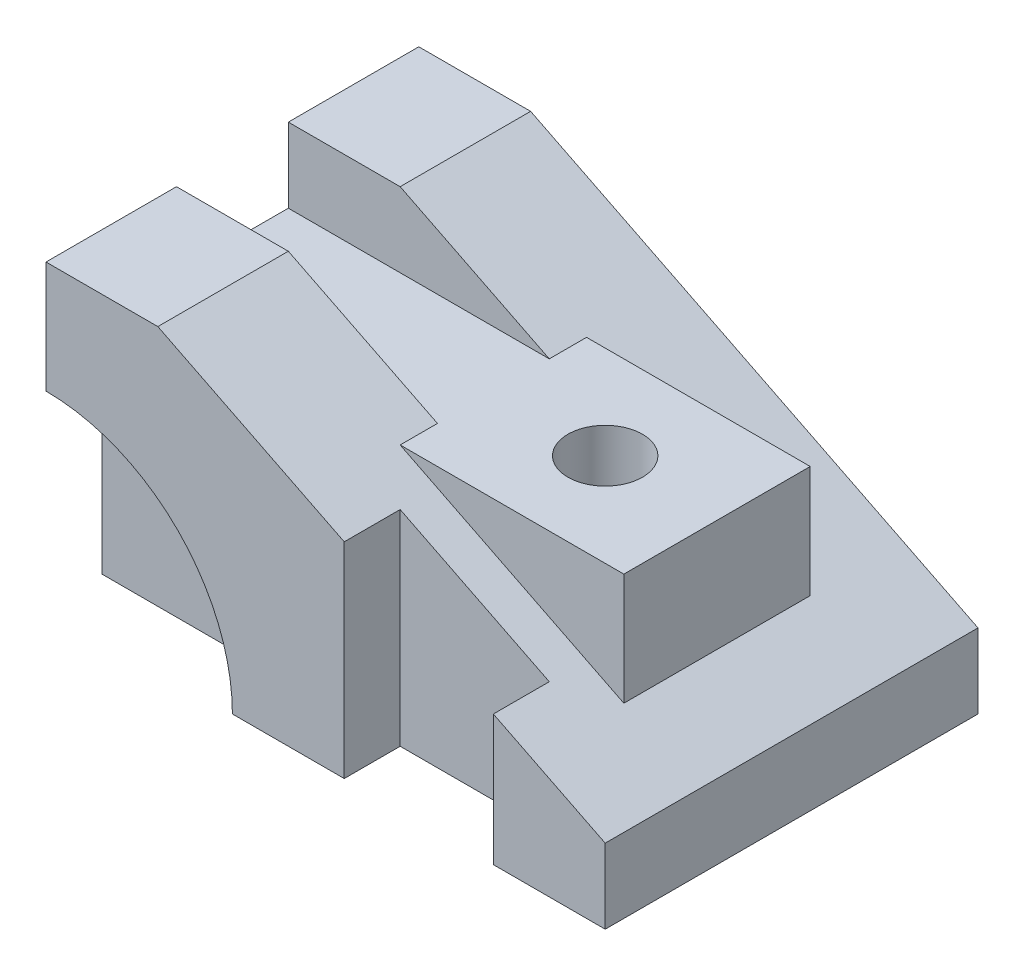
ISO-10303-21;
HEADER;
FILE_DESCRIPTION(('STEP AP214'),'2;1');
FILE_NAME('part.step','',(''),(''),'','','');
FILE_SCHEMA(('AUTOMOTIVE_DESIGN { 1 0 10303 214 1 1 1 1 }'));
ENDSEC;
DATA;
#1=APPLICATION_CONTEXT('core data for automotive mechanical design processes');
#2=APPLICATION_PROTOCOL_DEFINITION('international standard','automotive_design',2000,#1);
#3=PRODUCT_CONTEXT('',#1,'mechanical');
#4=PRODUCT('Part','Part','',(#3));
#5=PRODUCT_RELATED_PRODUCT_CATEGORY('part','',(#4));
#6=PRODUCT_DEFINITION_FORMATION('','',#4);
#7=PRODUCT_DEFINITION_CONTEXT('part definition',#1,'design');
#8=PRODUCT_DEFINITION('design','',#6,#7);
#9=PRODUCT_DEFINITION_SHAPE('','',#8);
#10=(LENGTH_UNIT() NAMED_UNIT(*) SI_UNIT(.MILLI.,.METRE.));
#11=(NAMED_UNIT(*) PLANE_ANGLE_UNIT() SI_UNIT($,.RADIAN.));
#12=(NAMED_UNIT(*) SI_UNIT($,.STERADIAN.) SOLID_ANGLE_UNIT());
#13=UNCERTAINTY_MEASURE_WITH_UNIT(LENGTH_MEASURE(1.E-05),#10,'distance_accuracy_value','');
#14=(GEOMETRIC_REPRESENTATION_CONTEXT(3) GLOBAL_UNCERTAINTY_ASSIGNED_CONTEXT((#13)) GLOBAL_UNIT_ASSIGNED_CONTEXT((#10,
#11,#12)) REPRESENTATION_CONTEXT('',''));
#15=CARTESIAN_POINT('',(0.,0.,0.));
#16=DIRECTION('',(0.,0.,1.));
#17=DIRECTION('',(1.,0.,0.));
#18=AXIS2_PLACEMENT_3D('',#15,#16,#17);
#19=CARTESIAN_POINT('',(0.,0.,50.));
#20=DIRECTION('',(-1.,0.,0.));
#21=DIRECTION('',(0.,0.,1.));
#22=AXIS2_PLACEMENT_3D('',#19,#20,#21);
#23=PLANE('',#22);
#24=DIRECTION('',(0.,1.,0.));
#25=VECTOR('',#24,1.);
#26=CARTESIAN_POINT('',(0.,0.,35.));
#27=LINE('',#26,#25);
#28=CARTESIAN_POINT('',(0.,0.,35.));
#29=VERTEX_POINT('',#28);
#30=CARTESIAN_POINT('',(0.,50.,35.));
#31=VERTEX_POINT('',#30);
#32=EDGE_CURVE('E56',#29,#31,#27,.T.);
#33=ORIENTED_EDGE('',*,*,#32,.T.);
#34=DIRECTION('',(0.,0.,-1.));
#35=VECTOR('',#34,1.);
#36=CARTESIAN_POINT('',(0.,50.,50.000012));
#37=LINE('',#36,#35);
#38=CARTESIAN_POINT('',(0.,50.,50.));
#39=VERTEX_POINT('',#38);
#40=EDGE_CURVE('E174',#31,#39,#37,.F.);
#41=ORIENTED_EDGE('',*,*,#40,.T.);
#42=DIRECTION('',(0.,1.,0.));
#43=VECTOR('',#42,1.);
#44=CARTESIAN_POINT('',(0.,0.,50.));
#45=LINE('',#44,#43);
#46=CARTESIAN_POINT('',(0.,80.,50.));
#47=VERTEX_POINT('',#46);
#48=EDGE_CURVE('E187',#39,#47,#45,.T.);
#49=ORIENTED_EDGE('',*,*,#48,.T.);
#50=DIRECTION('',(0.,0.,-1.));
#51=VECTOR('',#50,1.);
#52=CARTESIAN_POINT('',(0.,80.,50.));
#53=LINE('',#52,#51);
#54=CARTESIAN_POINT('',(0.,80.,15.));
#55=VERTEX_POINT('',#54);
#56=EDGE_CURVE('E221',#47,#55,#53,.T.);
#57=ORIENTED_EDGE('',*,*,#56,.T.);
#58=DIRECTION('',(0.,1.,0.));
#59=VECTOR('',#58,1.);
#60=CARTESIAN_POINT('',(0.,-16.157731058639,15.));
#61=LINE('',#60,#59);
#62=CARTESIAN_POINT('',(0.,60.,15.));
#63=VERTEX_POINT('',#62);
#64=EDGE_CURVE('E272',#63,#55,#61,.T.);
#65=ORIENTED_EDGE('',*,*,#64,.F.);
#66=DIRECTION('',(0.,0.,1.));
#67=VECTOR('',#66,1.);
#68=CARTESIAN_POINT('',(0.,60.,50.));
#69=LINE('',#68,#67);
#70=CARTESIAN_POINT('',(0.,60.,-15.));
#71=VERTEX_POINT('',#70);
#72=EDGE_CURVE('E263',#71,#63,#69,.T.);
#73=ORIENTED_EDGE('',*,*,#72,.F.);
#74=DIRECTION('',(0.,1.,0.));
#75=VECTOR('',#74,1.);
#76=CARTESIAN_POINT('',(0.,-16.157731058639,-15.));
#77=LINE('',#76,#75);
#78=CARTESIAN_POINT('',(0.,80.,-15.));
#79=VERTEX_POINT('',#78);
#80=EDGE_CURVE('E264',#71,#79,#77,.T.);
#81=ORIENTED_EDGE('',*,*,#80,.T.);
#82=CARTESIAN_POINT('',(0.,80.,-50.));
#83=VERTEX_POINT('',#82);
#84=EDGE_CURVE('E220',#79,#83,#53,.T.);
#85=ORIENTED_EDGE('',*,*,#84,.T.);
#86=DIRECTION('',(0.,1.,0.));
#87=VECTOR('',#86,1.);
#88=CARTESIAN_POINT('',(0.,0.,-50.));
#89=LINE('',#88,#87);
#90=CARTESIAN_POINT('',(0.,0.,-50.));
#91=VERTEX_POINT('',#90);
#92=EDGE_CURVE('E205',#91,#83,#89,.T.);
#93=ORIENTED_EDGE('',*,*,#92,.F.);
#94=DIRECTION('',(0.,0.,-1.));
#95=VECTOR('',#94,1.);
#96=CARTESIAN_POINT('',(0.,0.,50.));
#97=LINE('',#96,#95);
#98=EDGE_CURVE('E218',#29,#91,#97,.T.);
#99=ORIENTED_EDGE('',*,*,#98,.F.);
#100=EDGE_LOOP('',(#33,#41,#49,#57,#65,#73,#81,#85,#93,#99));
#101=FACE_BOUND('',#100,.T.);
#102=ADVANCED_FACE('F41',(#101),#23,.T.);
#103=CARTESIAN_POINT('',(0.,0.,50.));
#104=DIRECTION('',(0.,-1.,0.));
#105=DIRECTION('',(1.,0.,0.));
#106=AXIS2_PLACEMENT_3D('',#103,#104,#105);
#107=PLANE('',#106);
#108=CARTESIAN_POINT('',(100.,0.,0.));
#109=DIRECTION('',(0.,-1.,0.));
#110=DIRECTION('',(1.,0.,0.));
#111=AXIS2_PLACEMENT_3D('',#108,#109,#110);
#112=CIRCLE('',#111,9.99999999999999);
#113=CARTESIAN_POINT('',(100.,0.,9.99999999999999));
#114=VERTEX_POINT('',#113);
#115=EDGE_CURVE('E233',#114,#114,#112,.T.);
#116=ORIENTED_EDGE('',*,*,#115,.F.);
#117=EDGE_LOOP('',(#116));
#118=FACE_BOUND('',#117,.T.);
#119=DIRECTION('',(-1.,0.,0.));
#120=VECTOR('',#119,1.);
#121=CARTESIAN_POINT('',(0.,0.,50.));
#122=LINE('',#121,#120);
#123=CARTESIAN_POINT('',(80.,0.,50.));
#124=VERTEX_POINT('',#123);
#125=CARTESIAN_POINT('',(50.,0.,50.));
#126=VERTEX_POINT('',#125);
#127=EDGE_CURVE('E180',#124,#126,#122,.T.);
#128=ORIENTED_EDGE('',*,*,#127,.T.);
#129=DIRECTION('',(0.,0.,-1.));
#130=VECTOR('',#129,1.);
#131=CARTESIAN_POINT('',(50.,0.,50.000012));
#132=LINE('',#131,#130);
#133=CARTESIAN_POINT('',(50.,0.,35.));
#134=VERTEX_POINT('',#133);
#135=EDGE_CURVE('E11',#126,#134,#132,.T.);
#136=ORIENTED_EDGE('',*,*,#135,.T.);
#137=DIRECTION('',(-1.,0.,0.));
#138=VECTOR('',#137,1.);
#139=CARTESIAN_POINT('',(0.,0.,35.));
#140=LINE('',#139,#138);
#141=EDGE_CURVE('E49',#134,#29,#140,.T.);
#142=ORIENTED_EDGE('',*,*,#141,.T.);
#143=ORIENTED_EDGE('',*,*,#98,.T.);
#144=DIRECTION('',(-1.,0.,0.));
#145=VECTOR('',#144,1.);
#146=CARTESIAN_POINT('',(0.,0.,-50.));
#147=LINE('',#146,#145);
#148=CARTESIAN_POINT('',(150.,0.,-50.));
#149=VERTEX_POINT('',#148);
#150=EDGE_CURVE('E208',#149,#91,#147,.T.);
#151=ORIENTED_EDGE('',*,*,#150,.F.);
#152=DIRECTION('',(0.,0.,-1.));
#153=VECTOR('',#152,1.);
#154=CARTESIAN_POINT('',(150.,0.,50.));
#155=LINE('',#154,#153);
#156=CARTESIAN_POINT('',(150.,0.,50.));
#157=VERTEX_POINT('',#156);
#158=EDGE_CURVE('E216',#157,#149,#155,.T.);
#159=ORIENTED_EDGE('',*,*,#158,.F.);
#160=CARTESIAN_POINT('',(120.,0.,50.));
#161=VERTEX_POINT('',#160);
#162=EDGE_CURVE('E186',#157,#161,#122,.T.);
#163=ORIENTED_EDGE('',*,*,#162,.T.);
#164=DIRECTION('',(0.,0.,1.));
#165=VECTOR('',#164,1.);
#166=CARTESIAN_POINT('',(120.,0.,35.));
#167=LINE('',#166,#165);
#168=CARTESIAN_POINT('',(120.,0.,35.));
#169=VERTEX_POINT('',#168);
#170=EDGE_CURVE('E64',#169,#161,#167,.T.);
#171=ORIENTED_EDGE('',*,*,#170,.F.);
#172=DIRECTION('',(1.,0.,0.));
#173=VECTOR('',#172,1.);
#174=CARTESIAN_POINT('',(80.,0.,35.));
#175=LINE('',#174,#173);
#176=CARTESIAN_POINT('',(80.,0.,35.));
#177=VERTEX_POINT('',#176);
#178=EDGE_CURVE('E246',#177,#169,#175,.T.);
#179=ORIENTED_EDGE('',*,*,#178,.F.);
#180=DIRECTION('',(0.,0.,-1.));
#181=VECTOR('',#180,1.);
#182=CARTESIAN_POINT('',(80.,0.,50.));
#183=LINE('',#182,#181);
#184=EDGE_CURVE('E183',#124,#177,#183,.T.);
#185=ORIENTED_EDGE('',*,*,#184,.F.);
#186=EDGE_LOOP('',(#128,#136,#142,#143,#151,#159,#163,#171,#179,#185));
#187=FACE_BOUND('',#186,.T.);
#188=ADVANCED_FACE('F177',(#118,#187),#107,.T.);
#189=CARTESIAN_POINT('',(0.,0.,50.));
#190=DIRECTION('',(0.,0.,1.));
#191=DIRECTION('',(1.,0.,0.));
#192=AXIS2_PLACEMENT_3D('',#189,#190,#191);
#193=PLANE('',#192);
#194=ORIENTED_EDGE('',*,*,#48,.F.);
#195=CARTESIAN_POINT('',(0.,0.,50.));
#196=DIRECTION('',(0.,0.,1.));
#197=DIRECTION('',(1.,0.,0.));
#198=AXIS2_PLACEMENT_3D('',#195,#196,#197);
#199=CIRCLE('',#198,50.);
#200=EDGE_CURVE('E238',#39,#126,#199,.F.);
#201=ORIENTED_EDGE('',*,*,#200,.T.);
#202=ORIENTED_EDGE('',*,*,#127,.F.);
#203=DIRECTION('',(0.,-1.,0.));
#204=VECTOR('',#203,1.);
#205=CARTESIAN_POINT('',(80.,0.,50.));
#206=LINE('',#205,#204);
#207=CARTESIAN_POINT('',(80.,55.,50.));
#208=VERTEX_POINT('',#207);
#209=EDGE_CURVE('E169',#208,#124,#206,.T.);
#210=ORIENTED_EDGE('',*,*,#209,.F.);
#211=DIRECTION('',(0.894427190999916,-0.447213595499958,0.));
#212=VECTOR('',#211,1.);
#213=CARTESIAN_POINT('',(38.,76.,50.));
#214=LINE('',#213,#212);
#215=CARTESIAN_POINT('',(30.,80.,50.));
#216=VERTEX_POINT('',#215);
#217=EDGE_CURVE('E307',#216,#208,#214,.T.);
#218=ORIENTED_EDGE('',*,*,#217,.F.);
#219=DIRECTION('',(1.,0.,0.));
#220=VECTOR('',#219,1.);
#221=CARTESIAN_POINT('',(0.,80.,50.));
#222=LINE('',#221,#220);
#223=EDGE_CURVE('E191',#47,#216,#222,.T.);
#224=ORIENTED_EDGE('',*,*,#223,.F.);
#225=EDGE_LOOP('',(#194,#201,#202,#210,#218,#224));
#226=FACE_BOUND('',#225,.T.);
#227=ADVANCED_FACE('F316',(#226),#193,.T.);
#228=CARTESIAN_POINT('',(38.,76.,50.));
#229=DIRECTION('',(0.447213595499958,0.894427190999916,0.));
#230=DIRECTION('',(-0.894427190999916,0.447213595499958,0.));
#231=AXIS2_PLACEMENT_3D('',#228,#229,#230);
#232=PLANE('',#231);
#233=DIRECTION('',(0.,0.,1.));
#234=VECTOR('',#233,1.);
#235=CARTESIAN_POINT('',(80.,55.,50.));
#236=LINE('',#235,#234);
#237=CARTESIAN_POINT('',(80.,55.,35.));
#238=VERTEX_POINT('',#237);
#239=EDGE_CURVE('E256',#238,#208,#236,.T.);
#240=ORIENTED_EDGE('',*,*,#239,.F.);
#241=DIRECTION('',(-0.894427190999916,0.447213595499958,0.));
#242=VECTOR('',#241,1.);
#243=CARTESIAN_POINT('',(38.,76.,35.));
#244=LINE('',#243,#242);
#245=CARTESIAN_POINT('',(120.,35.,35.));
#246=VERTEX_POINT('',#245);
#247=EDGE_CURVE('E258',#246,#238,#244,.T.);
#248=ORIENTED_EDGE('',*,*,#247,.F.);
#249=DIRECTION('',(0.,0.,-1.));
#250=VECTOR('',#249,1.);
#251=CARTESIAN_POINT('',(120.,35.,50.));
#252=LINE('',#251,#250);
#253=CARTESIAN_POINT('',(120.,35.,50.));
#254=VERTEX_POINT('',#253);
#255=EDGE_CURVE('E253',#254,#246,#252,.T.);
#256=ORIENTED_EDGE('',*,*,#255,.F.);
#257=CARTESIAN_POINT('',(150.,20.,50.));
#258=VERTEX_POINT('',#257);
#259=EDGE_CURVE('E214',#254,#258,#214,.T.);
#260=ORIENTED_EDGE('',*,*,#259,.T.);
#261=DIRECTION('',(0.,0.,-1.));
#262=VECTOR('',#261,1.);
#263=CARTESIAN_POINT('',(150.,20.,50.));
#264=LINE('',#263,#262);
#265=CARTESIAN_POINT('',(150.,20.,-50.));
#266=VERTEX_POINT('',#265);
#267=EDGE_CURVE('E197',#258,#266,#264,.T.);
#268=ORIENTED_EDGE('',*,*,#267,.T.);
#269=DIRECTION('',(0.894427190999916,-0.447213595499958,0.));
#270=VECTOR('',#269,1.);
#271=CARTESIAN_POINT('',(38.,76.,-50.));
#272=LINE('',#271,#270);
#273=CARTESIAN_POINT('',(30.,80.,-50.));
#274=VERTEX_POINT('',#273);
#275=EDGE_CURVE('E198',#274,#266,#272,.T.);
#276=ORIENTED_EDGE('',*,*,#275,.F.);
#277=DIRECTION('',(0.,0.,-1.));
#278=VECTOR('',#277,1.);
#279=CARTESIAN_POINT('',(30.,80.,50.));
#280=LINE('',#279,#278);
#281=CARTESIAN_POINT('',(30.,80.,-15.));
#282=VERTEX_POINT('',#281);
#283=EDGE_CURVE('E224',#282,#274,#280,.T.);
#284=ORIENTED_EDGE('',*,*,#283,.F.);
#285=DIRECTION('',(0.894427190999916,-0.447213595499958,0.));
#286=VECTOR('',#285,1.);
#287=CARTESIAN_POINT('',(38.,76.,-15.));
#288=LINE('',#287,#286);
#289=CARTESIAN_POINT('',(70.,60.,-15.));
#290=VERTEX_POINT('',#289);
#291=EDGE_CURVE('E280',#282,#290,#288,.T.);
#292=ORIENTED_EDGE('',*,*,#291,.T.);
#293=DIRECTION('',(0.,0.,-1.));
#294=VECTOR('',#293,1.);
#295=CARTESIAN_POINT('',(70.,60.,25.));
#296=LINE('',#295,#294);
#297=CARTESIAN_POINT('',(70.,60.,-25.));
#298=VERTEX_POINT('',#297);
#299=EDGE_CURVE('E304',#290,#298,#296,.T.);
#300=ORIENTED_EDGE('',*,*,#299,.T.);
#301=DIRECTION('',(0.894427190999916,-0.447213595499958,0.));
#302=VECTOR('',#301,1.);
#303=CARTESIAN_POINT('',(38.,76.,-25.));
#304=LINE('',#303,#302);
#305=CARTESIAN_POINT('',(130.,30.,-25.));
#306=VERTEX_POINT('',#305);
#307=EDGE_CURVE('E296',#298,#306,#304,.T.);
#308=ORIENTED_EDGE('',*,*,#307,.T.);
#309=DIRECTION('',(0.,0.,-1.));
#310=VECTOR('',#309,1.);
#311=CARTESIAN_POINT('',(130.,30.,25.));
#312=LINE('',#311,#310);
#313=CARTESIAN_POINT('',(130.,30.,25.));
#314=VERTEX_POINT('',#313);
#315=EDGE_CURVE('E302',#314,#306,#312,.T.);
#316=ORIENTED_EDGE('',*,*,#315,.F.);
#317=DIRECTION('',(0.894427190999916,-0.447213595499958,0.));
#318=VECTOR('',#317,1.);
#319=CARTESIAN_POINT('',(38.,76.,25.));
#320=LINE('',#319,#318);
#321=CARTESIAN_POINT('',(70.,60.,25.));
#322=VERTEX_POINT('',#321);
#323=EDGE_CURVE('E287',#322,#314,#320,.T.);
#324=ORIENTED_EDGE('',*,*,#323,.F.);
#325=CARTESIAN_POINT('',(70.,60.,15.));
#326=VERTEX_POINT('',#325);
#327=EDGE_CURVE('E202',#322,#326,#296,.T.);
#328=ORIENTED_EDGE('',*,*,#327,.T.);
#329=DIRECTION('',(0.894427190999916,-0.447213595499958,0.));
#330=VECTOR('',#329,1.);
#331=CARTESIAN_POINT('',(38.,76.,15.));
#332=LINE('',#331,#330);
#333=CARTESIAN_POINT('',(30.,80.,15.));
#334=VERTEX_POINT('',#333);
#335=EDGE_CURVE('E277',#334,#326,#332,.T.);
#336=ORIENTED_EDGE('',*,*,#335,.F.);
#337=EDGE_CURVE('E225',#216,#334,#280,.T.);
#338=ORIENTED_EDGE('',*,*,#337,.F.);
#339=ORIENTED_EDGE('',*,*,#217,.T.);
#340=EDGE_LOOP('',(#240,#248,#256,#260,#268,#276,#284,#292,#300,#308,#316,#324,#328,#336,#338,#339));
#341=FACE_BOUND('',#340,.T.);
#342=ADVANCED_FACE('F43',(#341),#232,.T.);
#343=CARTESIAN_POINT('',(0.,80.,50.));
#344=DIRECTION('',(0.,1.,0.));
#345=DIRECTION('',(-1.,0.,0.));
#346=AXIS2_PLACEMENT_3D('',#343,#344,#345);
#347=PLANE('',#346);
#348=ORIENTED_EDGE('',*,*,#84,.F.);
#349=DIRECTION('',(1.,0.,0.));
#350=VECTOR('',#349,1.);
#351=CARTESIAN_POINT('',(0.,80.,-15.));
#352=LINE('',#351,#350);
#353=EDGE_CURVE('E260',#79,#282,#352,.T.);
#354=ORIENTED_EDGE('',*,*,#353,.T.);
#355=ORIENTED_EDGE('',*,*,#283,.T.);
#356=DIRECTION('',(1.,0.,0.));
#357=VECTOR('',#356,1.);
#358=CARTESIAN_POINT('',(0.,80.,-50.));
#359=LINE('',#358,#357);
#360=EDGE_CURVE('E201',#83,#274,#359,.T.);
#361=ORIENTED_EDGE('',*,*,#360,.F.);
#362=EDGE_LOOP('',(#348,#354,#355,#361));
#363=FACE_BOUND('',#362,.T.);
#364=ADVANCED_FACE('F336',(#363),#347,.T.);
#365=DIRECTION('',(1.,0.,0.));
#366=VECTOR('',#365,1.);
#367=CARTESIAN_POINT('',(0.,80.,15.));
#368=LINE('',#367,#366);
#369=EDGE_CURVE('E270',#55,#334,#368,.T.);
#370=ORIENTED_EDGE('',*,*,#369,.F.);
#371=ORIENTED_EDGE('',*,*,#56,.F.);
#372=ORIENTED_EDGE('',*,*,#223,.T.);
#373=ORIENTED_EDGE('',*,*,#337,.T.);
#374=EDGE_LOOP('',(#370,#371,#372,#373));
#375=FACE_BOUND('',#374,.T.);
#376=ADVANCED_FACE('F314',(#375),#347,.T.);
#377=CARTESIAN_POINT('',(150.,0.,50.));
#378=DIRECTION('',(1.,0.,0.));
#379=DIRECTION('',(0.,0.,-1.));
#380=AXIS2_PLACEMENT_3D('',#377,#378,#379);
#381=PLANE('',#380);
#382=DIRECTION('',(0.,-1.,0.));
#383=VECTOR('',#382,1.);
#384=CARTESIAN_POINT('',(150.,0.,-50.));
#385=LINE('',#384,#383);
#386=EDGE_CURVE('E211',#266,#149,#385,.T.);
#387=ORIENTED_EDGE('',*,*,#386,.F.);
#388=ORIENTED_EDGE('',*,*,#267,.F.);
#389=DIRECTION('',(0.,-1.,0.));
#390=VECTOR('',#389,1.);
#391=CARTESIAN_POINT('',(150.,0.,50.));
#392=LINE('',#391,#390);
#393=EDGE_CURVE('E190',#258,#157,#392,.T.);
#394=ORIENTED_EDGE('',*,*,#393,.T.);
#395=ORIENTED_EDGE('',*,*,#158,.T.);
#396=EDGE_LOOP('',(#387,#388,#394,#395));
#397=FACE_BOUND('',#396,.T.);
#398=ADVANCED_FACE('F347',(#397),#381,.T.);
#399=DIRECTION('',(0.,1.,0.));
#400=VECTOR('',#399,1.);
#401=CARTESIAN_POINT('',(120.,0.,50.));
#402=LINE('',#401,#400);
#403=EDGE_CURVE('E228',#161,#254,#402,.T.);
#404=ORIENTED_EDGE('',*,*,#403,.F.);
#405=ORIENTED_EDGE('',*,*,#162,.F.);
#406=ORIENTED_EDGE('',*,*,#393,.F.);
#407=ORIENTED_EDGE('',*,*,#259,.F.);
#408=EDGE_LOOP('',(#404,#405,#406,#407));
#409=FACE_BOUND('',#408,.T.);
#410=ADVANCED_FACE('F351',(#409),#193,.T.);
#411=CARTESIAN_POINT('',(0.,0.,-50.));
#412=DIRECTION('',(0.,0.,1.));
#413=DIRECTION('',(1.,0.,0.));
#414=AXIS2_PLACEMENT_3D('',#411,#412,#413);
#415=PLANE('',#414);
#416=ORIENTED_EDGE('',*,*,#275,.T.);
#417=ORIENTED_EDGE('',*,*,#386,.T.);
#418=ORIENTED_EDGE('',*,*,#150,.T.);
#419=ORIENTED_EDGE('',*,*,#92,.T.);
#420=ORIENTED_EDGE('',*,*,#360,.T.);
#421=EDGE_LOOP('',(#416,#417,#418,#419,#420));
#422=FACE_BOUND('',#421,.T.);
#423=ADVANCED_FACE('F342',(#422),#415,.F.);
#424=CARTESIAN_POINT('',(0.,60.,25.));
#425=DIRECTION('',(0.,1.,0.));
#426=DIRECTION('',(0.,0.,1.));
#427=AXIS2_PLACEMENT_3D('',#424,#425,#426);
#428=PLANE('',#427);
#429=CARTESIAN_POINT('',(100.,60.,0.));
#430=DIRECTION('',(0.,1.,0.));
#431=DIRECTION('',(0.,0.,1.));
#432=AXIS2_PLACEMENT_3D('',#429,#430,#431);
#433=CIRCLE('',#432,9.99999999999999);
#434=CARTESIAN_POINT('',(100.,60.,9.99999999999999));
#435=VERTEX_POINT('',#434);
#436=EDGE_CURVE('E231',#435,#435,#433,.T.);
#437=ORIENTED_EDGE('',*,*,#436,.F.);
#438=EDGE_LOOP('',(#437));
#439=FACE_BOUND('',#438,.T.);
#440=DIRECTION('',(1.,0.,0.));
#441=VECTOR('',#440,1.);
#442=CARTESIAN_POINT('',(0.,60.,-25.));
#443=LINE('',#442,#441);
#444=CARTESIAN_POINT('',(130.,60.,-25.));
#445=VERTEX_POINT('',#444);
#446=EDGE_CURVE('E283',#298,#445,#443,.T.);
#447=ORIENTED_EDGE('',*,*,#446,.F.);
#448=ORIENTED_EDGE('',*,*,#299,.F.);
#449=DIRECTION('',(-1.,0.,0.));
#450=VECTOR('',#449,1.);
#451=CARTESIAN_POINT('',(0.,60.,-15.));
#452=LINE('',#451,#450);
#453=EDGE_CURVE('E261',#290,#71,#452,.T.);
#454=ORIENTED_EDGE('',*,*,#453,.T.);
#455=ORIENTED_EDGE('',*,*,#72,.T.);
#456=DIRECTION('',(-1.,0.,0.));
#457=VECTOR('',#456,1.);
#458=CARTESIAN_POINT('',(0.,60.,15.));
#459=LINE('',#458,#457);
#460=EDGE_CURVE('E267',#326,#63,#459,.T.);
#461=ORIENTED_EDGE('',*,*,#460,.F.);
#462=ORIENTED_EDGE('',*,*,#327,.F.);
#463=DIRECTION('',(1.,0.,0.));
#464=VECTOR('',#463,1.);
#465=CARTESIAN_POINT('',(0.,60.,25.));
#466=LINE('',#465,#464);
#467=CARTESIAN_POINT('',(130.,60.,25.));
#468=VERTEX_POINT('',#467);
#469=EDGE_CURVE('E284',#322,#468,#466,.T.);
#470=ORIENTED_EDGE('',*,*,#469,.T.);
#471=DIRECTION('',(0.,0.,-1.));
#472=VECTOR('',#471,1.);
#473=CARTESIAN_POINT('',(130.,60.,25.));
#474=LINE('',#473,#472);
#475=EDGE_CURVE('E293',#468,#445,#474,.T.);
#476=ORIENTED_EDGE('',*,*,#475,.T.);
#477=EDGE_LOOP('',(#447,#448,#454,#455,#461,#462,#470,#476));
#478=FACE_BOUND('',#477,.T.);
#479=ADVANCED_FACE('F330',(#439,#478),#428,.T.);
#480=CARTESIAN_POINT('',(130.,0.,25.));
#481=DIRECTION('',(1.,0.,0.));
#482=DIRECTION('',(0.,0.,-1.));
#483=AXIS2_PLACEMENT_3D('',#480,#481,#482);
#484=PLANE('',#483);
#485=DIRECTION('',(0.,-1.,0.));
#486=VECTOR('',#485,1.);
#487=CARTESIAN_POINT('',(130.,0.,-25.));
#488=LINE('',#487,#486);
#489=EDGE_CURVE('E288',#445,#306,#488,.T.);
#490=ORIENTED_EDGE('',*,*,#489,.F.);
#491=ORIENTED_EDGE('',*,*,#475,.F.);
#492=DIRECTION('',(0.,-1.,0.));
#493=VECTOR('',#492,1.);
#494=CARTESIAN_POINT('',(130.,0.,25.));
#495=LINE('',#494,#493);
#496=EDGE_CURVE('E290',#468,#314,#495,.T.);
#497=ORIENTED_EDGE('',*,*,#496,.T.);
#498=ORIENTED_EDGE('',*,*,#315,.T.);
#499=EDGE_LOOP('',(#490,#491,#497,#498));
#500=FACE_BOUND('',#499,.T.);
#501=ADVANCED_FACE('F404',(#500),#484,.T.);
#502=CARTESIAN_POINT('',(0.,0.,25.));
#503=DIRECTION('',(0.,0.,1.));
#504=DIRECTION('',(1.,0.,0.));
#505=AXIS2_PLACEMENT_3D('',#502,#503,#504);
#506=PLANE('',#505);
#507=ORIENTED_EDGE('',*,*,#469,.F.);
#508=ORIENTED_EDGE('',*,*,#323,.T.);
#509=ORIENTED_EDGE('',*,*,#496,.F.);
#510=EDGE_LOOP('',(#507,#508,#509));
#511=FACE_BOUND('',#510,.T.);
#512=ADVANCED_FACE('F409',(#511),#506,.T.);
#513=CARTESIAN_POINT('',(0.,0.,-25.));
#514=DIRECTION('',(0.,0.,1.));
#515=DIRECTION('',(1.,0.,0.));
#516=AXIS2_PLACEMENT_3D('',#513,#514,#515);
#517=PLANE('',#516);
#518=ORIENTED_EDGE('',*,*,#446,.T.);
#519=ORIENTED_EDGE('',*,*,#489,.T.);
#520=ORIENTED_EDGE('',*,*,#307,.F.);
#521=EDGE_LOOP('',(#518,#519,#520));
#522=FACE_BOUND('',#521,.T.);
#523=ADVANCED_FACE('F413',(#522),#517,.F.);
#524=CARTESIAN_POINT('',(0.,-16.157731058639,-15.));
#525=DIRECTION('',(0.,0.,1.));
#526=DIRECTION('',(1.,0.,0.));
#527=AXIS2_PLACEMENT_3D('',#524,#525,#526);
#528=PLANE('',#527);
#529=ORIENTED_EDGE('',*,*,#353,.F.);
#530=ORIENTED_EDGE('',*,*,#80,.F.);
#531=ORIENTED_EDGE('',*,*,#453,.F.);
#532=ORIENTED_EDGE('',*,*,#291,.F.);
#533=EDGE_LOOP('',(#529,#530,#531,#532));
#534=FACE_BOUND('',#533,.T.);
#535=ADVANCED_FACE('F333',(#534),#528,.T.);
#536=CARTESIAN_POINT('',(0.,-16.157731058639,15.));
#537=DIRECTION('',(0.,0.,1.));
#538=DIRECTION('',(1.,0.,0.));
#539=AXIS2_PLACEMENT_3D('',#536,#537,#538);
#540=PLANE('',#539);
#541=ORIENTED_EDGE('',*,*,#335,.T.);
#542=ORIENTED_EDGE('',*,*,#460,.T.);
#543=ORIENTED_EDGE('',*,*,#64,.T.);
#544=ORIENTED_EDGE('',*,*,#369,.T.);
#545=EDGE_LOOP('',(#541,#542,#543,#544));
#546=FACE_BOUND('',#545,.T.);
#547=ADVANCED_FACE('F323',(#546),#540,.F.);
#548=CARTESIAN_POINT('',(80.,80.,50.));
#549=DIRECTION('',(-1.,0.,0.));
#550=DIRECTION('',(0.,0.,1.));
#551=AXIS2_PLACEMENT_3D('',#548,#549,#550);
#552=PLANE('',#551);
#553=ORIENTED_EDGE('',*,*,#239,.T.);
#554=ORIENTED_EDGE('',*,*,#209,.T.);
#555=ORIENTED_EDGE('',*,*,#184,.T.);
#556=DIRECTION('',(0.,-1.,0.));
#557=VECTOR('',#556,1.);
#558=CARTESIAN_POINT('',(80.,80.,35.));
#559=LINE('',#558,#557);
#560=EDGE_CURVE('E250',#238,#177,#559,.T.);
#561=ORIENTED_EDGE('',*,*,#560,.F.);
#562=EDGE_LOOP('',(#553,#554,#555,#561));
#563=FACE_BOUND('',#562,.T.);
#564=ADVANCED_FACE('F357',(#563),#552,.F.);
#565=CARTESIAN_POINT('',(120.,80.,35.));
#566=DIRECTION('',(1.,0.,0.));
#567=DIRECTION('',(0.,0.,-1.));
#568=AXIS2_PLACEMENT_3D('',#565,#566,#567);
#569=PLANE('',#568);
#570=ORIENTED_EDGE('',*,*,#255,.T.);
#571=DIRECTION('',(0.,-1.,0.));
#572=VECTOR('',#571,1.);
#573=CARTESIAN_POINT('',(120.,80.,35.));
#574=LINE('',#573,#572);
#575=EDGE_CURVE('E251',#246,#169,#574,.T.);
#576=ORIENTED_EDGE('',*,*,#575,.T.);
#577=ORIENTED_EDGE('',*,*,#170,.T.);
#578=ORIENTED_EDGE('',*,*,#403,.T.);
#579=EDGE_LOOP('',(#570,#576,#577,#578));
#580=FACE_BOUND('',#579,.T.);
#581=ADVANCED_FACE('F359',(#580),#569,.F.);
#582=CARTESIAN_POINT('',(80.,80.,35.));
#583=DIRECTION('',(0.,0.,-1.));
#584=DIRECTION('',(-1.,0.,0.));
#585=AXIS2_PLACEMENT_3D('',#582,#583,#584);
#586=PLANE('',#585);
#587=ORIENTED_EDGE('',*,*,#247,.T.);
#588=ORIENTED_EDGE('',*,*,#560,.T.);
#589=ORIENTED_EDGE('',*,*,#178,.T.);
#590=ORIENTED_EDGE('',*,*,#575,.F.);
#591=EDGE_LOOP('',(#587,#588,#589,#590));
#592=FACE_BOUND('',#591,.T.);
#593=ADVANCED_FACE('F354',(#592),#586,.F.);
#594=CARTESIAN_POINT('',(100.,-1.2E-05,0.));
#595=DIRECTION('',(0.,1.,0.));
#596=DIRECTION('',(0.,0.,1.));
#597=AXIS2_PLACEMENT_3D('',#594,#595,#596);
#598=CYLINDRICAL_SURFACE('',#597,9.99999999999999);
#599=CARTESIAN_POINT('',(100.,0.,9.99999999999999));
#600=CARTESIAN_POINT('',(100.,0.624999999999995,9.99999999999999));
#601=CARTESIAN_POINT('',(100.,1.25,9.99999999999999));
#602=CARTESIAN_POINT('',(100.,2.5,9.99999999999999));
#603=CARTESIAN_POINT('',(100.,3.125,9.99999999999999));
#604=CARTESIAN_POINT('',(100.,4.375,9.99999999999999));
#605=CARTESIAN_POINT('',(100.,5.,9.99999999999999));
#606=CARTESIAN_POINT('',(100.,6.25,9.99999999999999));
#607=CARTESIAN_POINT('',(100.,6.875,9.99999999999999));
#608=CARTESIAN_POINT('',(100.,8.125,9.99999999999999));
#609=CARTESIAN_POINT('',(100.,8.75,9.99999999999999));
#610=CARTESIAN_POINT('',(100.,10.,9.99999999999999));
#611=CARTESIAN_POINT('',(100.,10.625,9.99999999999999));
#612=CARTESIAN_POINT('',(100.,11.875,9.99999999999999));
#613=CARTESIAN_POINT('',(100.,12.5,9.99999999999999));
#614=CARTESIAN_POINT('',(100.,13.75,9.99999999999999));
#615=CARTESIAN_POINT('',(100.,14.375,9.99999999999999));
#616=CARTESIAN_POINT('',(100.,15.625,9.99999999999999));
#617=CARTESIAN_POINT('',(100.,16.25,9.99999999999999));
#618=CARTESIAN_POINT('',(100.,17.5,9.99999999999999));
#619=CARTESIAN_POINT('',(100.,18.125,9.99999999999999));
#620=CARTESIAN_POINT('',(100.,19.375,9.99999999999999));
#621=CARTESIAN_POINT('',(100.,20.,9.99999999999999));
#622=CARTESIAN_POINT('',(100.,21.25,9.99999999999999));
#623=CARTESIAN_POINT('',(100.,21.875,9.99999999999999));
#624=CARTESIAN_POINT('',(100.,23.125,9.99999999999999));
#625=CARTESIAN_POINT('',(100.,23.75,9.99999999999999));
#626=CARTESIAN_POINT('',(100.,25.,9.99999999999999));
#627=CARTESIAN_POINT('',(100.,25.625,9.99999999999999));
#628=CARTESIAN_POINT('',(100.,26.875,9.99999999999999));
#629=CARTESIAN_POINT('',(100.,27.5,9.99999999999999));
#630=CARTESIAN_POINT('',(100.,28.75,9.99999999999999));
#631=CARTESIAN_POINT('',(100.,29.375,9.99999999999999));
#632=CARTESIAN_POINT('',(100.,30.625,9.99999999999999));
#633=CARTESIAN_POINT('',(100.,31.25,9.99999999999999));
#634=CARTESIAN_POINT('',(100.,32.5,9.99999999999999));
#635=CARTESIAN_POINT('',(100.,33.125,9.99999999999999));
#636=CARTESIAN_POINT('',(100.,34.375,9.99999999999999));
#637=CARTESIAN_POINT('',(100.,35.,9.99999999999999));
#638=CARTESIAN_POINT('',(100.,36.25,9.99999999999999));
#639=CARTESIAN_POINT('',(100.,36.875,9.99999999999999));
#640=CARTESIAN_POINT('',(100.,38.125,9.99999999999999));
#641=CARTESIAN_POINT('',(100.,38.75,9.99999999999999));
#642=CARTESIAN_POINT('',(100.,40.,9.99999999999999));
#643=CARTESIAN_POINT('',(100.,40.625,9.99999999999999));
#644=CARTESIAN_POINT('',(100.,41.875,9.99999999999999));
#645=CARTESIAN_POINT('',(100.,42.5,9.99999999999999));
#646=CARTESIAN_POINT('',(100.,43.75,9.99999999999999));
#647=CARTESIAN_POINT('',(100.,44.375,9.99999999999999));
#648=CARTESIAN_POINT('',(100.,45.625,9.99999999999999));
#649=CARTESIAN_POINT('',(100.,46.25,9.99999999999999));
#650=CARTESIAN_POINT('',(100.,47.5,9.99999999999999));
#651=CARTESIAN_POINT('',(100.,48.125,9.99999999999999));
#652=CARTESIAN_POINT('',(100.,49.375,9.99999999999999));
#653=CARTESIAN_POINT('',(100.,50.,9.99999999999999));
#654=CARTESIAN_POINT('',(100.,51.25,9.99999999999999));
#655=CARTESIAN_POINT('',(100.,51.875,9.99999999999999));
#656=CARTESIAN_POINT('',(100.,53.125,9.99999999999999));
#657=CARTESIAN_POINT('',(100.,53.75,9.99999999999999));
#658=CARTESIAN_POINT('',(100.,55.,9.99999999999999));
#659=CARTESIAN_POINT('',(100.,55.625,9.99999999999999));
#660=CARTESIAN_POINT('',(100.,56.875,9.99999999999999));
#661=CARTESIAN_POINT('',(100.,57.5,9.99999999999999));
#662=CARTESIAN_POINT('',(100.,58.75,9.99999999999999));
#663=CARTESIAN_POINT('',(100.,59.375,9.99999999999999));
#664=CARTESIAN_POINT('',(100.,60.,9.99999999999999));
#665=B_SPLINE_CURVE_WITH_KNOTS('',3,(#599,#600,#601,#602,#603,#604,#605,#606,#607,#608,#609,
#610,#611,#612,#613,#614,#615,#616,#617,#618,#619,#620,#621,#622,#623,#624,#625,#626,#627,#628,
#629,#630,#631,#632,#633,#634,#635,#636,#637,#638,#639,#640,#641,#642,#643,#644,#645,#646,#647,
#648,#649,#650,#651,#652,#653,#654,#655,#656,#657,#658,#659,#660,#661,#662,#663,#664),
.UNSPECIFIED.,.F.,.F.,(4,2,2,2,2,2,2,2,2,2,2,2,2,2,2,2,2,2,2,2,2,2,2,2,2,2,2,2,2,2,2,2,4),(0.,
1.875,3.75,5.625,7.5,9.375,11.25,13.125,15.,16.875,18.75,20.625,22.5,24.375,26.25,28.125,30.,
31.875,33.75,35.625,37.5,39.375,41.25,43.125,45.,46.875,48.75,50.625,52.5,54.375,56.25,58.125,
60.),.UNSPECIFIED.);
#666=EDGE_CURVE('BSEAM449',#114,#435,#665,.T.);
#667=ORIENTED_EDGE('',*,*,#115,.T.);
#668=ORIENTED_EDGE('',*,*,#436,.T.);
#669=ORIENTED_EDGE('',*,*,#666,.T.);
#670=ORIENTED_EDGE('',*,*,#666,.F.);
#671=EDGE_LOOP('',(#667,#669,#668,#670));
#672=FACE_BOUND('',#671,.T.);
#673=ADVANCED_FACE('F449',(#672),#598,.F.);
#674=CARTESIAN_POINT('',(0.,0.,50.000012));
#675=DIRECTION('',(0.,0.,-1.));
#676=DIRECTION('',(-1.,0.,0.));
#677=AXIS2_PLACEMENT_3D('',#674,#675,#676);
#678=CYLINDRICAL_SURFACE('',#677,50.);
#679=CARTESIAN_POINT('',(0.,0.,35.));
#680=DIRECTION('',(0.,0.,1.));
#681=DIRECTION('',(1.,0.,0.));
#682=AXIS2_PLACEMENT_3D('',#679,#680,#681);
#683=CIRCLE('',#682,50.);
#684=EDGE_CURVE('E166',#134,#31,#683,.T.);
#685=ORIENTED_EDGE('',*,*,#684,.F.);
#686=ORIENTED_EDGE('',*,*,#135,.F.);
#687=ORIENTED_EDGE('',*,*,#200,.F.);
#688=ORIENTED_EDGE('',*,*,#40,.F.);
#689=EDGE_LOOP('',(#685,#686,#687,#688));
#690=FACE_BOUND('',#689,.T.);
#691=ADVANCED_FACE('F171',(#690),#678,.F.);
#692=CARTESIAN_POINT('',(0.,0.,35.));
#693=DIRECTION('',(0.,0.,1.));
#694=DIRECTION('',(1.,0.,0.));
#695=AXIS2_PLACEMENT_3D('',#692,#693,#694);
#696=PLANE('',#695);
#697=ORIENTED_EDGE('',*,*,#141,.F.);
#698=ORIENTED_EDGE('',*,*,#684,.T.);
#699=ORIENTED_EDGE('',*,*,#32,.F.);
#700=EDGE_LOOP('',(#697,#698,#699));
#701=FACE_BOUND('',#700,.T.);
#702=ADVANCED_FACE('F165',(#701),#696,.T.);
#703=CLOSED_SHELL('',(#102,#188,#227,#342,#364,#376,#398,#410,#423,#479,#501,#512,#523,#535,
#547,#564,#581,#593,#673,#691,#702));
#704=MANIFOLD_SOLID_BREP('B2',#703);
#705=ADVANCED_BREP_SHAPE_REPRESENTATION('',(#18,#704),#14);
#706=SHAPE_DEFINITION_REPRESENTATION(#9,#705);
ENDSEC;
END-ISO-10303-21;
